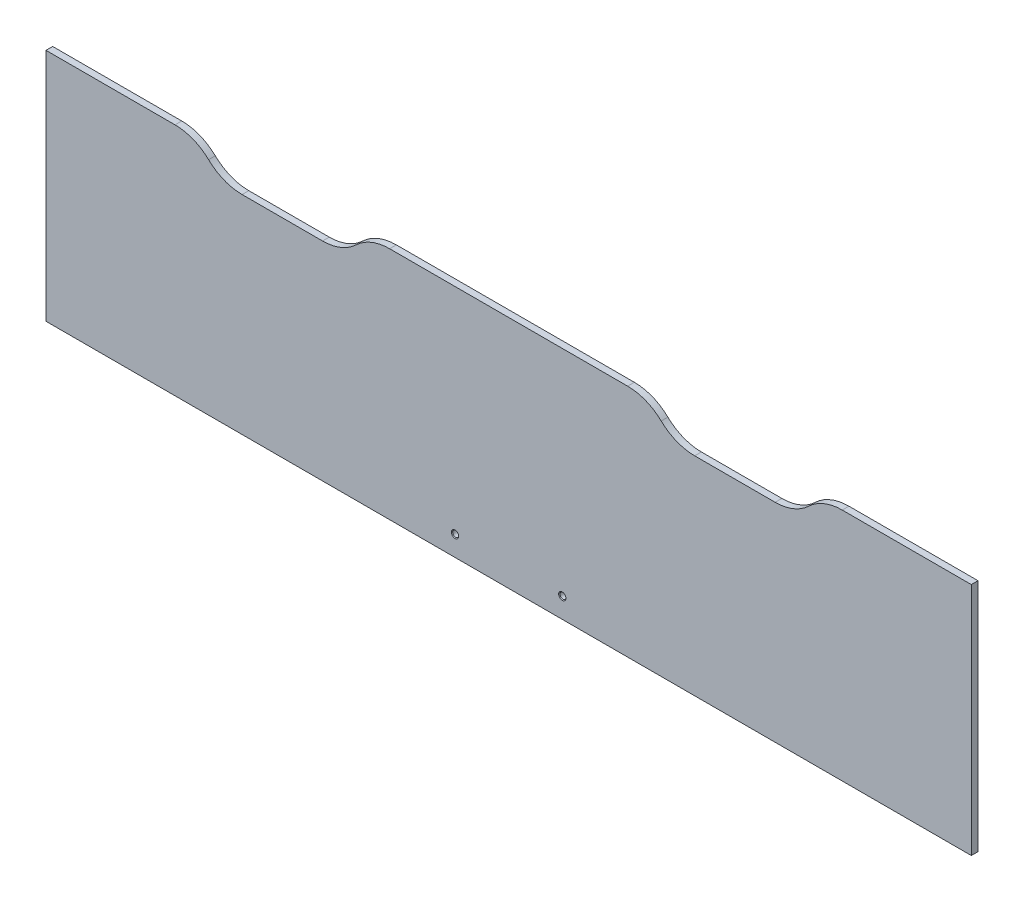
ISO-10303-21;
HEADER;
FILE_DESCRIPTION(('STEP AP214'),'2;1');
FILE_NAME('part.step','',(''),(''),'','','');
FILE_SCHEMA(('AUTOMOTIVE_DESIGN { 1 0 10303 214 1 1 1 1 }'));
ENDSEC;
DATA;
#1=APPLICATION_CONTEXT('core data for automotive mechanical design processes');
#2=APPLICATION_PROTOCOL_DEFINITION('international standard','automotive_design',2000,#1);
#3=PRODUCT_CONTEXT('',#1,'mechanical');
#4=PRODUCT('Part','Part','',(#3));
#5=PRODUCT_RELATED_PRODUCT_CATEGORY('part','',(#4));
#6=PRODUCT_DEFINITION_FORMATION('','',#4);
#7=PRODUCT_DEFINITION_CONTEXT('part definition',#1,'design');
#8=PRODUCT_DEFINITION('design','',#6,#7);
#9=PRODUCT_DEFINITION_SHAPE('','',#8);
#10=(LENGTH_UNIT() NAMED_UNIT(*) SI_UNIT(.MILLI.,.METRE.));
#11=(NAMED_UNIT(*) PLANE_ANGLE_UNIT() SI_UNIT($,.RADIAN.));
#12=(NAMED_UNIT(*) SI_UNIT($,.STERADIAN.) SOLID_ANGLE_UNIT());
#13=UNCERTAINTY_MEASURE_WITH_UNIT(LENGTH_MEASURE(1.E-05),#10,'distance_accuracy_value','');
#14=(GEOMETRIC_REPRESENTATION_CONTEXT(3) GLOBAL_UNCERTAINTY_ASSIGNED_CONTEXT((#13)) GLOBAL_UNIT_ASSIGNED_CONTEXT((#10,
#11,#12)) REPRESENTATION_CONTEXT('',''));
#15=CARTESIAN_POINT('',(0.,0.,0.));
#16=DIRECTION('',(0.,0.,1.));
#17=DIRECTION('',(1.,0.,0.));
#18=AXIS2_PLACEMENT_3D('',#15,#16,#17);
#19=CARTESIAN_POINT('',(0.,0.,6.35));
#20=DIRECTION('',(0.,0.,-1.));
#21=DIRECTION('',(-1.,0.,0.));
#22=AXIS2_PLACEMENT_3D('',#19,#20,#21);
#23=PLANE('',#22);
#24=CARTESIAN_POINT('',(50.8,19.05,6.35));
#25=DIRECTION('',(0.,0.,1.));
#26=DIRECTION('',(1.,0.,0.));
#27=AXIS2_PLACEMENT_3D('',#24,#25,#26);
#28=CIRCLE('',#27,3.4417);
#29=CARTESIAN_POINT('',(54.2417,19.05,6.35));
#30=VERTEX_POINT('',#29);
#31=EDGE_CURVE('E251',#30,#30,#28,.T.);
#32=ORIENTED_EDGE('',*,*,#31,.F.);
#33=EDGE_LOOP('',(#32));
#34=FACE_BOUND('',#33,.T.);
#35=CARTESIAN_POINT('',(-50.8,19.05,6.35));
#36=DIRECTION('',(0.,0.,1.));
#37=DIRECTION('',(1.,0.,0.));
#38=AXIS2_PLACEMENT_3D('',#35,#36,#37);
#39=CIRCLE('',#38,3.4417);
#40=CARTESIAN_POINT('',(-47.3583,19.05,6.35));
#41=VERTEX_POINT('',#40);
#42=EDGE_CURVE('E233',#41,#41,#39,.T.);
#43=ORIENTED_EDGE('',*,*,#42,.F.);
#44=EDGE_LOOP('',(#43));
#45=FACE_BOUND('',#44,.T.);
#46=CARTESIAN_POINT('',(-112.7125,176.2125,6.35));
#47=DIRECTION('',(0.,0.,1.));
#48=DIRECTION('',(-1.,0.,0.));
#49=AXIS2_PLACEMENT_3D('',#46,#47,#48);
#50=CIRCLE('',#49,46.0375);
#51=CARTESIAN_POINT('',(-112.7125,222.25,6.35));
#52=VERTEX_POINT('',#51);
#53=CARTESIAN_POINT('',(-144.4625,209.55,6.35));
#54=VERTEX_POINT('',#53);
#55=EDGE_CURVE('E174',#52,#54,#50,.T.);
#56=ORIENTED_EDGE('',*,*,#55,.T.);
#57=CARTESIAN_POINT('',(-176.2125,242.8875,6.35));
#58=DIRECTION('',(0.,0.,-1.));
#59=DIRECTION('',(1.,0.,0.));
#60=AXIS2_PLACEMENT_3D('',#57,#58,#59);
#61=CIRCLE('',#60,46.0375);
#62=CARTESIAN_POINT('',(-176.2125,196.85,6.35));
#63=VERTEX_POINT('',#62);
#64=EDGE_CURVE('E177',#54,#63,#61,.T.);
#65=ORIENTED_EDGE('',*,*,#64,.T.);
#66=DIRECTION('',(-1.,0.,0.));
#67=VECTOR('',#66,1.);
#68=CARTESIAN_POINT('',(-252.4125,196.85,6.35));
#69=LINE('',#68,#67);
#70=CARTESIAN_POINT('',(-252.4125,196.85,6.35));
#71=VERTEX_POINT('',#70);
#72=EDGE_CURVE('E188',#63,#71,#69,.T.);
#73=ORIENTED_EDGE('',*,*,#72,.T.);
#74=CARTESIAN_POINT('',(-252.4125,242.8875,6.35));
#75=DIRECTION('',(0.,0.,-1.));
#76=DIRECTION('',(1.,0.,0.));
#77=AXIS2_PLACEMENT_3D('',#74,#75,#76);
#78=CIRCLE('',#77,46.0375);
#79=CARTESIAN_POINT('',(-284.1625,209.55,6.35));
#80=VERTEX_POINT('',#79);
#81=EDGE_CURVE('E186',#71,#80,#78,.T.);
#82=ORIENTED_EDGE('',*,*,#81,.T.);
#83=CARTESIAN_POINT('',(-315.9125,176.2125,6.35));
#84=DIRECTION('',(0.,0.,1.));
#85=DIRECTION('',(-1.,0.,0.));
#86=AXIS2_PLACEMENT_3D('',#83,#84,#85);
#87=CIRCLE('',#86,46.0375);
#88=CARTESIAN_POINT('',(-315.9125,222.25,6.35));
#89=VERTEX_POINT('',#88);
#90=EDGE_CURVE('E165',#80,#89,#87,.T.);
#91=ORIENTED_EDGE('',*,*,#90,.T.);
#92=DIRECTION('',(-1.,0.,0.));
#93=VECTOR('',#92,1.);
#94=CARTESIAN_POINT('',(-438.15,222.25,6.35));
#95=LINE('',#94,#93);
#96=CARTESIAN_POINT('',(-438.15,222.25,6.35));
#97=VERTEX_POINT('',#96);
#98=EDGE_CURVE('E269',#89,#97,#95,.T.);
#99=ORIENTED_EDGE('',*,*,#98,.T.);
#100=DIRECTION('',(0.,-1.,0.));
#101=VECTOR('',#100,1.);
#102=CARTESIAN_POINT('',(-438.15,0.,6.35));
#103=LINE('',#102,#101);
#104=CARTESIAN_POINT('',(-438.15,0.,6.35));
#105=VERTEX_POINT('',#104);
#106=EDGE_CURVE('E261',#97,#105,#103,.T.);
#107=ORIENTED_EDGE('',*,*,#106,.T.);
#108=DIRECTION('',(1.,0.,0.));
#109=VECTOR('',#108,1.);
#110=CARTESIAN_POINT('',(-438.15,0.,6.35));
#111=LINE('',#110,#109);
#112=CARTESIAN_POINT('',(438.15,0.,6.35));
#113=VERTEX_POINT('',#112);
#114=EDGE_CURVE('E264',#105,#113,#111,.T.);
#115=ORIENTED_EDGE('',*,*,#114,.T.);
#116=DIRECTION('',(0.,1.,0.));
#117=VECTOR('',#116,1.);
#118=CARTESIAN_POINT('',(438.15,0.,6.35));
#119=LINE('',#118,#117);
#120=CARTESIAN_POINT('',(438.15,222.25,6.35));
#121=VERTEX_POINT('',#120);
#122=EDGE_CURVE('E267',#113,#121,#119,.T.);
#123=ORIENTED_EDGE('',*,*,#122,.T.);
#124=CARTESIAN_POINT('',(315.9125,222.25,6.35));
#125=VERTEX_POINT('',#124);
#126=EDGE_CURVE('E270',#121,#125,#95,.T.);
#127=ORIENTED_EDGE('',*,*,#126,.T.);
#128=CARTESIAN_POINT('',(315.9125,176.2125,6.35));
#129=DIRECTION('',(0.,0.,-1.));
#130=DIRECTION('',(1.,0.,0.));
#131=AXIS2_PLACEMENT_3D('',#128,#129,#130);
#132=CIRCLE('',#131,46.0375);
#133=CARTESIAN_POINT('',(284.1625,209.55,6.35));
#134=VERTEX_POINT('',#133);
#135=EDGE_CURVE('E206',#134,#125,#132,.T.);
#136=ORIENTED_EDGE('',*,*,#135,.F.);
#137=CARTESIAN_POINT('',(252.4125,242.8875,6.35));
#138=DIRECTION('',(0.,0.,1.));
#139=DIRECTION('',(-1.,0.,0.));
#140=AXIS2_PLACEMENT_3D('',#137,#138,#139);
#141=CIRCLE('',#140,46.0375);
#142=CARTESIAN_POINT('',(252.4125,196.85,6.35));
#143=VERTEX_POINT('',#142);
#144=EDGE_CURVE('E226',#143,#134,#141,.T.);
#145=ORIENTED_EDGE('',*,*,#144,.F.);
#146=DIRECTION('',(1.,0.,0.));
#147=VECTOR('',#146,1.);
#148=CARTESIAN_POINT('',(252.4125,196.85,6.35));
#149=LINE('',#148,#147);
#150=CARTESIAN_POINT('',(176.2125,196.85,6.35));
#151=VERTEX_POINT('',#150);
#152=EDGE_CURVE('E223',#151,#143,#149,.T.);
#153=ORIENTED_EDGE('',*,*,#152,.F.);
#154=CARTESIAN_POINT('',(176.2125,242.8875,6.35));
#155=DIRECTION('',(0.,0.,1.));
#156=DIRECTION('',(-1.,0.,0.));
#157=AXIS2_PLACEMENT_3D('',#154,#155,#156);
#158=CIRCLE('',#157,46.0375);
#159=CARTESIAN_POINT('',(144.4625,209.55,6.35));
#160=VERTEX_POINT('',#159);
#161=EDGE_CURVE('E220',#160,#151,#158,.T.);
#162=ORIENTED_EDGE('',*,*,#161,.F.);
#163=CARTESIAN_POINT('',(112.7125,176.2125,6.35));
#164=DIRECTION('',(0.,0.,-1.));
#165=DIRECTION('',(1.,0.,0.));
#166=AXIS2_PLACEMENT_3D('',#163,#164,#165);
#167=CIRCLE('',#166,46.0375);
#168=CARTESIAN_POINT('',(112.7125,222.25,6.35));
#169=VERTEX_POINT('',#168);
#170=EDGE_CURVE('E196',#169,#160,#167,.T.);
#171=ORIENTED_EDGE('',*,*,#170,.F.);
#172=EDGE_CURVE('E274',#169,#52,#95,.T.);
#173=ORIENTED_EDGE('',*,*,#172,.T.);
#174=EDGE_LOOP('',(#56,#65,#73,#82,#91,#99,#107,#115,#123,#127,#136,#145,#153,#162,#171,#173));
#175=FACE_BOUND('',#174,.T.);
#176=ADVANCED_FACE('F39',(#34,#45,#175),#23,.F.);
#177=CARTESIAN_POINT('',(0.,0.,0.));
#178=DIRECTION('',(0.,0.,-1.));
#179=DIRECTION('',(-1.,0.,0.));
#180=AXIS2_PLACEMENT_3D('',#177,#178,#179);
#181=PLANE('',#180);
#182=CARTESIAN_POINT('',(50.8,19.05,0.));
#183=DIRECTION('',(0.,0.,1.));
#184=DIRECTION('',(1.,0.,0.));
#185=AXIS2_PLACEMENT_3D('',#182,#183,#184);
#186=CIRCLE('',#185,2.8067);
#187=CARTESIAN_POINT('',(53.6067,19.05,0.));
#188=VERTEX_POINT('',#187);
#189=EDGE_CURVE('E257',#188,#188,#186,.T.);
#190=ORIENTED_EDGE('',*,*,#189,.T.);
#191=EDGE_LOOP('',(#190));
#192=FACE_BOUND('',#191,.T.);
#193=CARTESIAN_POINT('',(-50.8,19.05,0.));
#194=DIRECTION('',(0.,0.,1.));
#195=DIRECTION('',(1.,0.,0.));
#196=AXIS2_PLACEMENT_3D('',#193,#194,#195);
#197=CIRCLE('',#196,2.8067);
#198=CARTESIAN_POINT('',(-47.9933,19.05,0.));
#199=VERTEX_POINT('',#198);
#200=EDGE_CURVE('E248',#199,#199,#197,.T.);
#201=ORIENTED_EDGE('',*,*,#200,.T.);
#202=EDGE_LOOP('',(#201));
#203=FACE_BOUND('',#202,.T.);
#204=CARTESIAN_POINT('',(-176.2125,242.8875,0.));
#205=DIRECTION('',(0.,0.,-1.));
#206=DIRECTION('',(1.,0.,0.));
#207=AXIS2_PLACEMENT_3D('',#204,#205,#206);
#208=CIRCLE('',#207,46.0375);
#209=CARTESIAN_POINT('',(-144.4625,209.55,0.));
#210=VERTEX_POINT('',#209);
#211=CARTESIAN_POINT('',(-176.2125,196.85,0.));
#212=VERTEX_POINT('',#211);
#213=EDGE_CURVE('E181',#210,#212,#208,.T.);
#214=ORIENTED_EDGE('',*,*,#213,.F.);
#215=CARTESIAN_POINT('',(-112.7125,176.2125,0.));
#216=DIRECTION('',(0.,0.,1.));
#217=DIRECTION('',(-1.,0.,0.));
#218=AXIS2_PLACEMENT_3D('',#215,#216,#217);
#219=CIRCLE('',#218,46.0375);
#220=CARTESIAN_POINT('',(-112.7125,222.25,0.));
#221=VERTEX_POINT('',#220);
#222=EDGE_CURVE('E183',#221,#210,#219,.T.);
#223=ORIENTED_EDGE('',*,*,#222,.F.);
#224=DIRECTION('',(-1.,0.,0.));
#225=VECTOR('',#224,1.);
#226=CARTESIAN_POINT('',(-438.15,222.25,0.));
#227=LINE('',#226,#225);
#228=CARTESIAN_POINT('',(112.7125,222.25,0.));
#229=VERTEX_POINT('',#228);
#230=EDGE_CURVE('E283',#229,#221,#227,.T.);
#231=ORIENTED_EDGE('',*,*,#230,.F.);
#232=CARTESIAN_POINT('',(112.7125,176.2125,0.));
#233=DIRECTION('',(0.,0.,-1.));
#234=DIRECTION('',(1.,0.,0.));
#235=AXIS2_PLACEMENT_3D('',#232,#233,#234);
#236=CIRCLE('',#235,46.0375);
#237=CARTESIAN_POINT('',(144.4625,209.55,0.));
#238=VERTEX_POINT('',#237);
#239=EDGE_CURVE('E203',#229,#238,#236,.T.);
#240=ORIENTED_EDGE('',*,*,#239,.T.);
#241=CARTESIAN_POINT('',(176.2125,242.8875,0.));
#242=DIRECTION('',(0.,0.,1.));
#243=DIRECTION('',(-1.,0.,0.));
#244=AXIS2_PLACEMENT_3D('',#241,#242,#243);
#245=CIRCLE('',#244,46.0375);
#246=CARTESIAN_POINT('',(176.2125,196.85,0.));
#247=VERTEX_POINT('',#246);
#248=EDGE_CURVE('E62',#238,#247,#245,.T.);
#249=ORIENTED_EDGE('',*,*,#248,.T.);
#250=DIRECTION('',(1.,0.,0.));
#251=VECTOR('',#250,1.);
#252=CARTESIAN_POINT('',(252.4125,196.85,0.));
#253=LINE('',#252,#251);
#254=CARTESIAN_POINT('',(252.4125,196.85,0.));
#255=VERTEX_POINT('',#254);
#256=EDGE_CURVE('E208',#247,#255,#253,.T.);
#257=ORIENTED_EDGE('',*,*,#256,.T.);
#258=CARTESIAN_POINT('',(252.4125,242.8875,0.));
#259=DIRECTION('',(0.,0.,1.));
#260=DIRECTION('',(-1.,0.,0.));
#261=AXIS2_PLACEMENT_3D('',#258,#259,#260);
#262=CIRCLE('',#261,46.0375);
#263=CARTESIAN_POINT('',(284.1625,209.55,0.));
#264=VERTEX_POINT('',#263);
#265=EDGE_CURVE('E211',#255,#264,#262,.T.);
#266=ORIENTED_EDGE('',*,*,#265,.T.);
#267=CARTESIAN_POINT('',(315.9125,176.2125,0.));
#268=DIRECTION('',(0.,0.,-1.));
#269=DIRECTION('',(1.,0.,0.));
#270=AXIS2_PLACEMENT_3D('',#267,#268,#269);
#271=CIRCLE('',#270,46.0375);
#272=CARTESIAN_POINT('',(315.9125,222.25,0.));
#273=VERTEX_POINT('',#272);
#274=EDGE_CURVE('E214',#264,#273,#271,.T.);
#275=ORIENTED_EDGE('',*,*,#274,.T.);
#276=CARTESIAN_POINT('',(438.15,222.25,0.));
#277=VERTEX_POINT('',#276);
#278=EDGE_CURVE('E265',#277,#273,#227,.T.);
#279=ORIENTED_EDGE('',*,*,#278,.F.);
#280=DIRECTION('',(0.,1.,0.));
#281=VECTOR('',#280,1.);
#282=CARTESIAN_POINT('',(438.15,0.,0.));
#283=LINE('',#282,#281);
#284=CARTESIAN_POINT('',(438.15,0.,0.));
#285=VERTEX_POINT('',#284);
#286=EDGE_CURVE('E279',#285,#277,#283,.T.);
#287=ORIENTED_EDGE('',*,*,#286,.F.);
#288=DIRECTION('',(1.,0.,0.));
#289=VECTOR('',#288,1.);
#290=CARTESIAN_POINT('',(-438.15,0.,0.));
#291=LINE('',#290,#289);
#292=CARTESIAN_POINT('',(-438.15,0.,0.));
#293=VERTEX_POINT('',#292);
#294=EDGE_CURVE('E277',#293,#285,#291,.T.);
#295=ORIENTED_EDGE('',*,*,#294,.F.);
#296=DIRECTION('',(0.,-1.,0.));
#297=VECTOR('',#296,1.);
#298=CARTESIAN_POINT('',(-438.15,0.,0.));
#299=LINE('',#298,#297);
#300=CARTESIAN_POINT('',(-438.15,222.25,0.));
#301=VERTEX_POINT('',#300);
#302=EDGE_CURVE('E260',#301,#293,#299,.T.);
#303=ORIENTED_EDGE('',*,*,#302,.F.);
#304=CARTESIAN_POINT('',(-315.9125,222.25,0.));
#305=VERTEX_POINT('',#304);
#306=EDGE_CURVE('E173',#305,#301,#227,.T.);
#307=ORIENTED_EDGE('',*,*,#306,.F.);
#308=CARTESIAN_POINT('',(-315.9125,176.2125,0.));
#309=DIRECTION('',(0.,0.,1.));
#310=DIRECTION('',(-1.,0.,0.));
#311=AXIS2_PLACEMENT_3D('',#308,#309,#310);
#312=CIRCLE('',#311,46.0375);
#313=CARTESIAN_POINT('',(-284.1625,209.55,0.));
#314=VERTEX_POINT('',#313);
#315=EDGE_CURVE('E54',#314,#305,#312,.T.);
#316=ORIENTED_EDGE('',*,*,#315,.F.);
#317=CARTESIAN_POINT('',(-252.4125,242.8875,0.));
#318=DIRECTION('',(0.,0.,-1.));
#319=DIRECTION('',(1.,0.,0.));
#320=AXIS2_PLACEMENT_3D('',#317,#318,#319);
#321=CIRCLE('',#320,46.0375);
#322=CARTESIAN_POINT('',(-252.4125,196.85,0.));
#323=VERTEX_POINT('',#322);
#324=EDGE_CURVE('E153',#323,#314,#321,.T.);
#325=ORIENTED_EDGE('',*,*,#324,.F.);
#326=DIRECTION('',(-1.,0.,0.));
#327=VECTOR('',#326,1.);
#328=CARTESIAN_POINT('',(-252.4125,196.85,0.));
#329=LINE('',#328,#327);
#330=EDGE_CURVE('E161',#212,#323,#329,.T.);
#331=ORIENTED_EDGE('',*,*,#330,.F.);
#332=EDGE_LOOP('',(#214,#223,#231,#240,#249,#257,#266,#275,#279,#287,#295,#303,#307,#316,#325,#331));
#333=FACE_BOUND('',#332,.T.);
#334=ADVANCED_FACE('F171',(#192,#203,#333),#181,.T.);
#335=CARTESIAN_POINT('',(-438.15,222.25,6.35));
#336=DIRECTION('',(0.,-1.,0.));
#337=DIRECTION('',(0.,0.,-1.));
#338=AXIS2_PLACEMENT_3D('',#335,#336,#337);
#339=PLANE('',#338);
#340=DIRECTION('',(0.,0.,1.));
#341=VECTOR('',#340,1.);
#342=CARTESIAN_POINT('',(-315.9125,222.25,0.));
#343=LINE('',#342,#341);
#344=EDGE_CURVE('E167',#305,#89,#343,.T.);
#345=ORIENTED_EDGE('',*,*,#344,.F.);
#346=ORIENTED_EDGE('',*,*,#306,.T.);
#347=DIRECTION('',(0.,0.,-1.));
#348=VECTOR('',#347,1.);
#349=CARTESIAN_POINT('',(-438.15,222.25,6.35));
#350=LINE('',#349,#348);
#351=EDGE_CURVE('E273',#97,#301,#350,.T.);
#352=ORIENTED_EDGE('',*,*,#351,.F.);
#353=ORIENTED_EDGE('',*,*,#98,.F.);
#354=EDGE_LOOP('',(#345,#346,#352,#353));
#355=FACE_BOUND('',#354,.T.);
#356=ADVANCED_FACE('F311',(#355),#339,.F.);
#357=DIRECTION('',(0.,0.,1.));
#358=VECTOR('',#357,1.);
#359=CARTESIAN_POINT('',(315.9125,222.25,0.));
#360=LINE('',#359,#358);
#361=EDGE_CURVE('E230',#273,#125,#360,.T.);
#362=ORIENTED_EDGE('',*,*,#361,.T.);
#363=ORIENTED_EDGE('',*,*,#126,.F.);
#364=DIRECTION('',(0.,0.,-1.));
#365=VECTOR('',#364,1.);
#366=CARTESIAN_POINT('',(438.15,222.25,6.35));
#367=LINE('',#366,#365);
#368=EDGE_CURVE('E286',#121,#277,#367,.T.);
#369=ORIENTED_EDGE('',*,*,#368,.T.);
#370=ORIENTED_EDGE('',*,*,#278,.T.);
#371=EDGE_LOOP('',(#362,#363,#369,#370));
#372=FACE_BOUND('',#371,.T.);
#373=ADVANCED_FACE('F299',(#372),#339,.F.);
#374=CARTESIAN_POINT('',(-438.15,0.,6.35));
#375=DIRECTION('',(1.,0.,0.));
#376=DIRECTION('',(0.,0.,-1.));
#377=AXIS2_PLACEMENT_3D('',#374,#375,#376);
#378=PLANE('',#377);
#379=ORIENTED_EDGE('',*,*,#302,.T.);
#380=DIRECTION('',(0.,0.,-1.));
#381=VECTOR('',#380,1.);
#382=CARTESIAN_POINT('',(-438.15,0.,6.35));
#383=LINE('',#382,#381);
#384=EDGE_CURVE('E11',#105,#293,#383,.T.);
#385=ORIENTED_EDGE('',*,*,#384,.F.);
#386=ORIENTED_EDGE('',*,*,#106,.F.);
#387=ORIENTED_EDGE('',*,*,#351,.T.);
#388=EDGE_LOOP('',(#379,#385,#386,#387));
#389=FACE_BOUND('',#388,.T.);
#390=ADVANCED_FACE('F41',(#389),#378,.F.);
#391=CARTESIAN_POINT('',(-438.15,0.,6.35));
#392=DIRECTION('',(0.,1.,0.));
#393=DIRECTION('',(0.,0.,1.));
#394=AXIS2_PLACEMENT_3D('',#391,#392,#393);
#395=PLANE('',#394);
#396=ORIENTED_EDGE('',*,*,#294,.T.);
#397=DIRECTION('',(0.,0.,-1.));
#398=VECTOR('',#397,1.);
#399=CARTESIAN_POINT('',(438.15,0.,6.35));
#400=LINE('',#399,#398);
#401=EDGE_CURVE('E47',#113,#285,#400,.T.);
#402=ORIENTED_EDGE('',*,*,#401,.F.);
#403=ORIENTED_EDGE('',*,*,#114,.F.);
#404=ORIENTED_EDGE('',*,*,#384,.T.);
#405=EDGE_LOOP('',(#396,#402,#403,#404));
#406=FACE_BOUND('',#405,.T.);
#407=ADVANCED_FACE('F306',(#406),#395,.F.);
#408=CARTESIAN_POINT('',(438.15,0.,6.35));
#409=DIRECTION('',(-1.,0.,0.));
#410=DIRECTION('',(0.,0.,1.));
#411=AXIS2_PLACEMENT_3D('',#408,#409,#410);
#412=PLANE('',#411);
#413=ORIENTED_EDGE('',*,*,#286,.T.);
#414=ORIENTED_EDGE('',*,*,#368,.F.);
#415=ORIENTED_EDGE('',*,*,#122,.F.);
#416=ORIENTED_EDGE('',*,*,#401,.T.);
#417=EDGE_LOOP('',(#413,#414,#415,#416));
#418=FACE_BOUND('',#417,.T.);
#419=ADVANCED_FACE('F293',(#418),#412,.F.);
#420=ORIENTED_EDGE('',*,*,#230,.T.);
#421=DIRECTION('',(0.,0.,1.));
#422=VECTOR('',#421,1.);
#423=CARTESIAN_POINT('',(-112.7125,222.25,0.));
#424=LINE('',#423,#422);
#425=EDGE_CURVE('E193',#221,#52,#424,.T.);
#426=ORIENTED_EDGE('',*,*,#425,.T.);
#427=ORIENTED_EDGE('',*,*,#172,.F.);
#428=DIRECTION('',(0.,0.,1.));
#429=VECTOR('',#428,1.);
#430=CARTESIAN_POINT('',(112.7125,222.25,0.));
#431=LINE('',#430,#429);
#432=EDGE_CURVE('E217',#229,#169,#431,.T.);
#433=ORIENTED_EDGE('',*,*,#432,.F.);
#434=EDGE_LOOP('',(#420,#426,#427,#433));
#435=FACE_BOUND('',#434,.T.);
#436=ADVANCED_FACE('F316',(#435),#339,.F.);
#437=CARTESIAN_POINT('',(50.8,19.05,6.35));
#438=DIRECTION('',(0.,0.,1.));
#439=DIRECTION('',(1.,0.,0.));
#440=AXIS2_PLACEMENT_3D('',#437,#438,#439);
#441=CYLINDRICAL_SURFACE('',#440,2.8067);
#442=ORIENTED_EDGE('',*,*,#189,.F.);
#443=EDGE_LOOP('',(#442));
#444=FACE_BOUND('',#443,.T.);
#445=CARTESIAN_POINT('',(50.8,19.05,5.715));
#446=DIRECTION('',(0.,0.,1.));
#447=DIRECTION('',(1.,0.,0.));
#448=AXIS2_PLACEMENT_3D('',#445,#446,#447);
#449=CIRCLE('',#448,2.8067);
#450=CARTESIAN_POINT('',(53.6067,19.05,5.715));
#451=VERTEX_POINT('',#450);
#452=EDGE_CURVE('E254',#451,#451,#449,.T.);
#453=ORIENTED_EDGE('',*,*,#452,.T.);
#454=EDGE_LOOP('',(#453));
#455=FACE_BOUND('',#454,.T.);
#456=ADVANCED_FACE('F351',(#444,#455),#441,.F.);
#457=CARTESIAN_POINT('',(50.8,19.05,6.35));
#458=DIRECTION('',(0.,0.,1.));
#459=DIRECTION('',(1.,0.,0.));
#460=AXIS2_PLACEMENT_3D('',#457,#458,#459);
#461=CONICAL_SURFACE('',#460,3.4417,0.785398163397443);
#462=ORIENTED_EDGE('',*,*,#452,.F.);
#463=EDGE_LOOP('',(#462));
#464=FACE_BOUND('',#463,.T.);
#465=ORIENTED_EDGE('',*,*,#31,.T.);
#466=EDGE_LOOP('',(#465));
#467=FACE_BOUND('',#466,.T.);
#468=ADVANCED_FACE('F465',(#464,#467),#461,.F.);
#469=CARTESIAN_POINT('',(-50.8,19.05,6.35));
#470=DIRECTION('',(0.,0.,1.));
#471=DIRECTION('',(1.,0.,0.));
#472=AXIS2_PLACEMENT_3D('',#469,#470,#471);
#473=CYLINDRICAL_SURFACE('',#472,2.8067);
#474=ORIENTED_EDGE('',*,*,#200,.F.);
#475=EDGE_LOOP('',(#474));
#476=FACE_BOUND('',#475,.T.);
#477=CARTESIAN_POINT('',(-50.8,19.05,5.715));
#478=DIRECTION('',(0.,0.,1.));
#479=DIRECTION('',(1.,0.,0.));
#480=AXIS2_PLACEMENT_3D('',#477,#478,#479);
#481=CIRCLE('',#480,2.8067);
#482=CARTESIAN_POINT('',(-47.9933,19.05,5.715));
#483=VERTEX_POINT('',#482);
#484=EDGE_CURVE('E245',#483,#483,#481,.T.);
#485=ORIENTED_EDGE('',*,*,#484,.T.);
#486=EDGE_LOOP('',(#485));
#487=FACE_BOUND('',#486,.T.);
#488=ADVANCED_FACE('F454',(#476,#487),#473,.F.);
#489=CARTESIAN_POINT('',(-50.8,19.05,6.35));
#490=DIRECTION('',(0.,0.,1.));
#491=DIRECTION('',(1.,0.,0.));
#492=AXIS2_PLACEMENT_3D('',#489,#490,#491);
#493=CONICAL_SURFACE('',#492,3.4417,0.785398163397443);
#494=ORIENTED_EDGE('',*,*,#484,.F.);
#495=EDGE_LOOP('',(#494));
#496=FACE_BOUND('',#495,.T.);
#497=ORIENTED_EDGE('',*,*,#42,.T.);
#498=EDGE_LOOP('',(#497));
#499=FACE_BOUND('',#498,.T.);
#500=ADVANCED_FACE('F437',(#496,#499),#493,.F.);
#501=CARTESIAN_POINT('',(315.9125,176.2125,0.));
#502=DIRECTION('',(0.,0.,1.));
#503=DIRECTION('',(1.,0.,0.));
#504=AXIS2_PLACEMENT_3D('',#501,#502,#503);
#505=CYLINDRICAL_SURFACE('',#504,46.0375);
#506=ORIENTED_EDGE('',*,*,#135,.T.);
#507=ORIENTED_EDGE('',*,*,#361,.F.);
#508=ORIENTED_EDGE('',*,*,#274,.F.);
#509=DIRECTION('',(0.,0.,1.));
#510=VECTOR('',#509,1.);
#511=CARTESIAN_POINT('',(284.1625,209.55,0.));
#512=LINE('',#511,#510);
#513=EDGE_CURVE('E234',#264,#134,#512,.T.);
#514=ORIENTED_EDGE('',*,*,#513,.T.);
#515=EDGE_LOOP('',(#506,#507,#508,#514));
#516=FACE_BOUND('',#515,.T.);
#517=ADVANCED_FACE('F427',(#516),#505,.T.);
#518=CARTESIAN_POINT('',(252.4125,242.8875,0.));
#519=DIRECTION('',(0.,0.,1.));
#520=DIRECTION('',(1.,0.,0.));
#521=AXIS2_PLACEMENT_3D('',#518,#519,#520);
#522=CYLINDRICAL_SURFACE('',#521,46.0375);
#523=ORIENTED_EDGE('',*,*,#144,.T.);
#524=ORIENTED_EDGE('',*,*,#513,.F.);
#525=ORIENTED_EDGE('',*,*,#265,.F.);
#526=DIRECTION('',(0.,0.,1.));
#527=VECTOR('',#526,1.);
#528=CARTESIAN_POINT('',(252.4125,196.85,0.));
#529=LINE('',#528,#527);
#530=EDGE_CURVE('E236',#255,#143,#529,.T.);
#531=ORIENTED_EDGE('',*,*,#530,.T.);
#532=EDGE_LOOP('',(#523,#524,#525,#531));
#533=FACE_BOUND('',#532,.T.);
#534=ADVANCED_FACE('F416',(#533),#522,.F.);
#535=CARTESIAN_POINT('',(252.4125,196.85,0.));
#536=DIRECTION('',(0.,-1.,0.));
#537=DIRECTION('',(0.,0.,-1.));
#538=AXIS2_PLACEMENT_3D('',#535,#536,#537);
#539=PLANE('',#538);
#540=ORIENTED_EDGE('',*,*,#152,.T.);
#541=ORIENTED_EDGE('',*,*,#530,.F.);
#542=ORIENTED_EDGE('',*,*,#256,.F.);
#543=DIRECTION('',(0.,0.,1.));
#544=VECTOR('',#543,1.);
#545=CARTESIAN_POINT('',(176.2125,196.85,0.));
#546=LINE('',#545,#544);
#547=EDGE_CURVE('E238',#247,#151,#546,.T.);
#548=ORIENTED_EDGE('',*,*,#547,.T.);
#549=EDGE_LOOP('',(#540,#541,#542,#548));
#550=FACE_BOUND('',#549,.T.);
#551=ADVANCED_FACE('F406',(#550),#539,.F.);
#552=CARTESIAN_POINT('',(176.2125,242.8875,0.));
#553=DIRECTION('',(0.,0.,1.));
#554=DIRECTION('',(1.,0.,0.));
#555=AXIS2_PLACEMENT_3D('',#552,#553,#554);
#556=CYLINDRICAL_SURFACE('',#555,46.0375);
#557=ORIENTED_EDGE('',*,*,#161,.T.);
#558=ORIENTED_EDGE('',*,*,#547,.F.);
#559=ORIENTED_EDGE('',*,*,#248,.F.);
#560=DIRECTION('',(0.,0.,1.));
#561=VECTOR('',#560,1.);
#562=CARTESIAN_POINT('',(144.4625,209.55,0.));
#563=LINE('',#562,#561);
#564=EDGE_CURVE('E240',#238,#160,#563,.T.);
#565=ORIENTED_EDGE('',*,*,#564,.T.);
#566=EDGE_LOOP('',(#557,#558,#559,#565));
#567=FACE_BOUND('',#566,.T.);
#568=ADVANCED_FACE('F394',(#567),#556,.F.);
#569=CARTESIAN_POINT('',(112.7125,176.2125,0.));
#570=DIRECTION('',(0.,0.,1.));
#571=DIRECTION('',(1.,0.,0.));
#572=AXIS2_PLACEMENT_3D('',#569,#570,#571);
#573=CYLINDRICAL_SURFACE('',#572,46.0375);
#574=ORIENTED_EDGE('',*,*,#170,.T.);
#575=ORIENTED_EDGE('',*,*,#564,.F.);
#576=ORIENTED_EDGE('',*,*,#239,.F.);
#577=ORIENTED_EDGE('',*,*,#432,.T.);
#578=EDGE_LOOP('',(#574,#575,#576,#577));
#579=FACE_BOUND('',#578,.T.);
#580=ADVANCED_FACE('F389',(#579),#573,.T.);
#581=CARTESIAN_POINT('',(-112.7125,176.2125,0.));
#582=DIRECTION('',(0.,0.,1.));
#583=DIRECTION('',(1.,0.,0.));
#584=AXIS2_PLACEMENT_3D('',#581,#582,#583);
#585=CYLINDRICAL_SURFACE('',#584,46.0375);
#586=ORIENTED_EDGE('',*,*,#55,.F.);
#587=ORIENTED_EDGE('',*,*,#425,.F.);
#588=ORIENTED_EDGE('',*,*,#222,.T.);
#589=DIRECTION('',(0.,0.,1.));
#590=VECTOR('',#589,1.);
#591=CARTESIAN_POINT('',(-144.4625,209.55,0.));
#592=LINE('',#591,#590);
#593=EDGE_CURVE('E197',#210,#54,#592,.T.);
#594=ORIENTED_EDGE('',*,*,#593,.T.);
#595=EDGE_LOOP('',(#586,#587,#588,#594));
#596=FACE_BOUND('',#595,.T.);
#597=ADVANCED_FACE('F322',(#596),#585,.T.);
#598=CARTESIAN_POINT('',(-176.2125,242.8875,0.));
#599=DIRECTION('',(0.,0.,1.));
#600=DIRECTION('',(1.,0.,0.));
#601=AXIS2_PLACEMENT_3D('',#598,#599,#600);
#602=CYLINDRICAL_SURFACE('',#601,46.0375);
#603=ORIENTED_EDGE('',*,*,#64,.F.);
#604=ORIENTED_EDGE('',*,*,#593,.F.);
#605=ORIENTED_EDGE('',*,*,#213,.T.);
#606=DIRECTION('',(0.,0.,1.));
#607=VECTOR('',#606,1.);
#608=CARTESIAN_POINT('',(-176.2125,196.85,0.));
#609=LINE('',#608,#607);
#610=EDGE_CURVE('E199',#212,#63,#609,.T.);
#611=ORIENTED_EDGE('',*,*,#610,.T.);
#612=EDGE_LOOP('',(#603,#604,#605,#611));
#613=FACE_BOUND('',#612,.T.);
#614=ADVANCED_FACE('F325',(#613),#602,.F.);
#615=CARTESIAN_POINT('',(-252.4125,196.85,0.));
#616=DIRECTION('',(0.,1.,0.));
#617=DIRECTION('',(0.,0.,1.));
#618=AXIS2_PLACEMENT_3D('',#615,#616,#617);
#619=PLANE('',#618);
#620=ORIENTED_EDGE('',*,*,#72,.F.);
#621=ORIENTED_EDGE('',*,*,#610,.F.);
#622=ORIENTED_EDGE('',*,*,#330,.T.);
#623=DIRECTION('',(0.,0.,1.));
#624=VECTOR('',#623,1.);
#625=CARTESIAN_POINT('',(-252.4125,196.85,0.));
#626=LINE('',#625,#624);
#627=EDGE_CURVE('E158',#323,#71,#626,.T.);
#628=ORIENTED_EDGE('',*,*,#627,.T.);
#629=EDGE_LOOP('',(#620,#621,#622,#628));
#630=FACE_BOUND('',#629,.T.);
#631=ADVANCED_FACE('F331',(#630),#619,.T.);
#632=CARTESIAN_POINT('',(-252.4125,242.8875,0.));
#633=DIRECTION('',(0.,0.,1.));
#634=DIRECTION('',(1.,0.,0.));
#635=AXIS2_PLACEMENT_3D('',#632,#633,#634);
#636=CYLINDRICAL_SURFACE('',#635,46.0375);
#637=ORIENTED_EDGE('',*,*,#81,.F.);
#638=ORIENTED_EDGE('',*,*,#627,.F.);
#639=ORIENTED_EDGE('',*,*,#324,.T.);
#640=DIRECTION('',(0.,0.,1.));
#641=VECTOR('',#640,1.);
#642=CARTESIAN_POINT('',(-284.1625,209.55,0.));
#643=LINE('',#642,#641);
#644=EDGE_CURVE('E156',#314,#80,#643,.T.);
#645=ORIENTED_EDGE('',*,*,#644,.T.);
#646=EDGE_LOOP('',(#637,#638,#639,#645));
#647=FACE_BOUND('',#646,.T.);
#648=ADVANCED_FACE('F155',(#647),#636,.F.);
#649=CARTESIAN_POINT('',(-315.9125,176.2125,0.));
#650=DIRECTION('',(0.,0.,1.));
#651=DIRECTION('',(1.,0.,0.));
#652=AXIS2_PLACEMENT_3D('',#649,#650,#651);
#653=CYLINDRICAL_SURFACE('',#652,46.0375);
#654=ORIENTED_EDGE('',*,*,#90,.F.);
#655=ORIENTED_EDGE('',*,*,#644,.F.);
#656=ORIENTED_EDGE('',*,*,#315,.T.);
#657=ORIENTED_EDGE('',*,*,#344,.T.);
#658=EDGE_LOOP('',(#654,#655,#656,#657));
#659=FACE_BOUND('',#658,.T.);
#660=ADVANCED_FACE('F163',(#659),#653,.T.);
#661=CLOSED_SHELL('',(#176,#334,#356,#373,#390,#407,#419,#436,#456,#468,#488,#500,#517,#534,
#551,#568,#580,#597,#614,#631,#648,#660));
#662=MANIFOLD_SOLID_BREP('B2',#661);
#663=ADVANCED_BREP_SHAPE_REPRESENTATION('',(#18,#662),#14);
#664=SHAPE_DEFINITION_REPRESENTATION(#9,#663);
ENDSEC;
END-ISO-10303-21;
